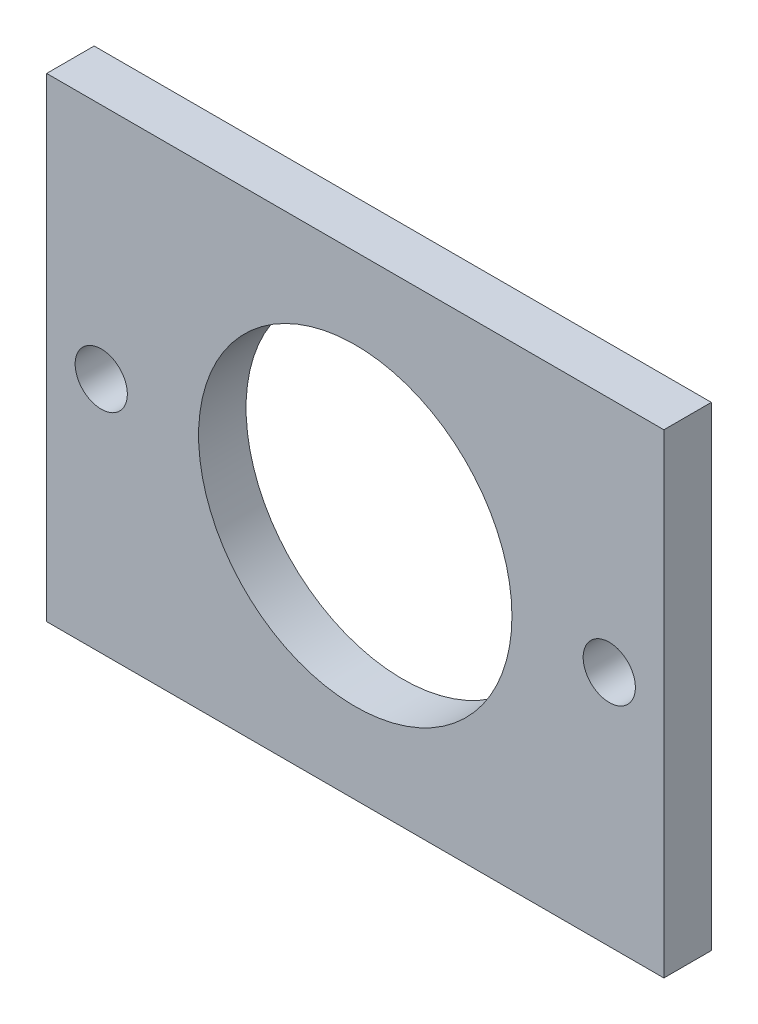
ISO-10303-21;
HEADER;
FILE_DESCRIPTION(('STEP AP214'),'2;1');
FILE_NAME('part.step','',(''),(''),'','','');
FILE_SCHEMA(('AUTOMOTIVE_DESIGN { 1 0 10303 214 1 1 1 1 }'));
ENDSEC;
DATA;
#1=APPLICATION_CONTEXT('core data for automotive mechanical design processes');
#2=APPLICATION_PROTOCOL_DEFINITION('international standard','automotive_design',2000,#1);
#3=PRODUCT_CONTEXT('',#1,'mechanical');
#4=PRODUCT('Part','Part','',(#3));
#5=PRODUCT_RELATED_PRODUCT_CATEGORY('part','',(#4));
#6=PRODUCT_DEFINITION_FORMATION('','',#4);
#7=PRODUCT_DEFINITION_CONTEXT('part definition',#1,'design');
#8=PRODUCT_DEFINITION('design','',#6,#7);
#9=PRODUCT_DEFINITION_SHAPE('','',#8);
#10=(LENGTH_UNIT() NAMED_UNIT(*) SI_UNIT(.MILLI.,.METRE.));
#11=(NAMED_UNIT(*) PLANE_ANGLE_UNIT() SI_UNIT($,.RADIAN.));
#12=(NAMED_UNIT(*) SI_UNIT($,.STERADIAN.) SOLID_ANGLE_UNIT());
#13=UNCERTAINTY_MEASURE_WITH_UNIT(LENGTH_MEASURE(1.E-05),#10,'distance_accuracy_value','');
#14=(GEOMETRIC_REPRESENTATION_CONTEXT(3) GLOBAL_UNCERTAINTY_ASSIGNED_CONTEXT((#13)) GLOBAL_UNIT_ASSIGNED_CONTEXT((#10,
#11,#12)) REPRESENTATION_CONTEXT('',''));
#15=CARTESIAN_POINT('',(0.,0.,0.));
#16=DIRECTION('',(0.,0.,1.));
#17=DIRECTION('',(1.,0.,0.));
#18=AXIS2_PLACEMENT_3D('',#15,#16,#17);
#19=CARTESIAN_POINT('',(0.,0.,9.2));
#20=DIRECTION('',(0.,0.,-1.));
#21=DIRECTION('',(-1.,0.,0.));
#22=AXIS2_PLACEMENT_3D('',#19,#20,#21);
#23=PLANE('',#22);
#24=DIRECTION('',(0.,-1.,0.));
#25=VECTOR('',#24,1.);
#26=CARTESIAN_POINT('',(-0.5,-10.,9.2));
#27=LINE('',#26,#25);
#28=CARTESIAN_POINT('',(-0.5,10.,9.2));
#29=VERTEX_POINT('',#28);
#30=CARTESIAN_POINT('',(-0.5,-10.,9.2));
#31=VERTEX_POINT('',#30);
#32=EDGE_CURVE('E91',#29,#31,#27,.T.);
#33=ORIENTED_EDGE('',*,*,#32,.T.);
#34=DIRECTION('',(1.,0.,0.));
#35=VECTOR('',#34,1.);
#36=CARTESIAN_POINT('',(-0.5,-10.,9.2));
#37=LINE('',#36,#35);
#38=CARTESIAN_POINT('',(25.5,-10.,9.2));
#39=VERTEX_POINT('',#38);
#40=EDGE_CURVE('E86',#31,#39,#37,.T.);
#41=ORIENTED_EDGE('',*,*,#40,.T.);
#42=DIRECTION('',(0.,1.,0.));
#43=VECTOR('',#42,1.);
#44=CARTESIAN_POINT('',(25.5,-10.,9.2));
#45=LINE('',#44,#43);
#46=CARTESIAN_POINT('',(25.5,10.,9.2));
#47=VERTEX_POINT('',#46);
#48=EDGE_CURVE('E87',#39,#47,#45,.T.);
#49=ORIENTED_EDGE('',*,*,#48,.T.);
#50=DIRECTION('',(-1.,0.,0.));
#51=VECTOR('',#50,1.);
#52=CARTESIAN_POINT('',(-0.5,10.,9.2));
#53=LINE('',#52,#51);
#54=EDGE_CURVE('E57',#47,#29,#53,.T.);
#55=ORIENTED_EDGE('',*,*,#54,.T.);
#56=EDGE_LOOP('',(#33,#41,#49,#55));
#57=FACE_BOUND('',#56,.T.);
#58=CARTESIAN_POINT('',(12.5,0.,9.2));
#59=DIRECTION('',(0.,0.,1.));
#60=DIRECTION('',(1.,0.,0.));
#61=AXIS2_PLACEMENT_3D('',#58,#59,#60);
#62=CIRCLE('',#61,6.6);
#63=CARTESIAN_POINT('',(19.1,0.,9.2));
#64=VERTEX_POINT('',#63);
#65=EDGE_CURVE('E107',#64,#64,#62,.T.);
#66=ORIENTED_EDGE('',*,*,#65,.F.);
#67=EDGE_LOOP('',(#66));
#68=FACE_BOUND('',#67,.T.);
#69=CARTESIAN_POINT('',(1.8,0.,9.2));
#70=DIRECTION('',(0.,0.,1.));
#71=DIRECTION('',(1.,0.,0.));
#72=AXIS2_PLACEMENT_3D('',#69,#70,#71);
#73=CIRCLE('',#72,1.1);
#74=CARTESIAN_POINT('',(2.9,0.,9.2));
#75=VERTEX_POINT('',#74);
#76=EDGE_CURVE('E123',#75,#75,#73,.T.);
#77=ORIENTED_EDGE('',*,*,#76,.F.);
#78=EDGE_LOOP('',(#77));
#79=FACE_BOUND('',#78,.T.);
#80=CARTESIAN_POINT('',(23.2,0.,9.2));
#81=DIRECTION('',(0.,0.,1.));
#82=DIRECTION('',(1.,0.,0.));
#83=AXIS2_PLACEMENT_3D('',#80,#81,#82);
#84=CIRCLE('',#83,1.1);
#85=CARTESIAN_POINT('',(24.3,0.,9.2));
#86=VERTEX_POINT('',#85);
#87=EDGE_CURVE('E130',#86,#86,#84,.T.);
#88=ORIENTED_EDGE('',*,*,#87,.F.);
#89=EDGE_LOOP('',(#88));
#90=FACE_BOUND('',#89,.T.);
#91=ADVANCED_FACE('F39',(#57,#68,#79,#90),#23,.F.);
#92=CARTESIAN_POINT('',(0.,0.,7.2));
#93=DIRECTION('',(0.,0.,-1.));
#94=DIRECTION('',(-1.,0.,0.));
#95=AXIS2_PLACEMENT_3D('',#92,#93,#94);
#96=PLANE('',#95);
#97=CARTESIAN_POINT('',(1.8,0.,7.2));
#98=DIRECTION('',(0.,0.,1.));
#99=DIRECTION('',(1.,0.,0.));
#100=AXIS2_PLACEMENT_3D('',#97,#98,#99);
#101=CIRCLE('',#100,1.1);
#102=CARTESIAN_POINT('',(2.9,0.,7.2));
#103=VERTEX_POINT('',#102);
#104=EDGE_CURVE('E125',#103,#103,#101,.T.);
#105=ORIENTED_EDGE('',*,*,#104,.T.);
#106=EDGE_LOOP('',(#105));
#107=FACE_BOUND('',#106,.T.);
#108=DIRECTION('',(0.,-1.,0.));
#109=VECTOR('',#108,1.);
#110=CARTESIAN_POINT('',(-0.5,-10.,7.2));
#111=LINE('',#110,#109);
#112=CARTESIAN_POINT('',(-0.5,10.,7.2));
#113=VERTEX_POINT('',#112);
#114=CARTESIAN_POINT('',(-0.5,-10.,7.2));
#115=VERTEX_POINT('',#114);
#116=EDGE_CURVE('E104',#113,#115,#111,.T.);
#117=ORIENTED_EDGE('',*,*,#116,.F.);
#118=DIRECTION('',(-1.,0.,0.));
#119=VECTOR('',#118,1.);
#120=CARTESIAN_POINT('',(-0.5,10.,7.2));
#121=LINE('',#120,#119);
#122=CARTESIAN_POINT('',(25.5,10.,7.2));
#123=VERTEX_POINT('',#122);
#124=EDGE_CURVE('E80',#123,#113,#121,.T.);
#125=ORIENTED_EDGE('',*,*,#124,.F.);
#126=DIRECTION('',(0.,1.,0.));
#127=VECTOR('',#126,1.);
#128=CARTESIAN_POINT('',(25.5,-10.,7.2));
#129=LINE('',#128,#127);
#130=CARTESIAN_POINT('',(25.5,-10.,7.2));
#131=VERTEX_POINT('',#130);
#132=EDGE_CURVE('E75',#131,#123,#129,.T.);
#133=ORIENTED_EDGE('',*,*,#132,.F.);
#134=DIRECTION('',(1.,0.,0.));
#135=VECTOR('',#134,1.);
#136=CARTESIAN_POINT('',(-0.5,-10.,7.2));
#137=LINE('',#136,#135);
#138=EDGE_CURVE('E94',#115,#131,#137,.T.);
#139=ORIENTED_EDGE('',*,*,#138,.F.);
#140=EDGE_LOOP('',(#117,#125,#133,#139));
#141=FACE_BOUND('',#140,.T.);
#142=CARTESIAN_POINT('',(12.5,0.,7.2));
#143=DIRECTION('',(0.,0.,1.));
#144=DIRECTION('',(1.,0.,0.));
#145=AXIS2_PLACEMENT_3D('',#142,#143,#144);
#146=CIRCLE('',#145,6.6);
#147=CARTESIAN_POINT('',(19.1,0.,7.2));
#148=VERTEX_POINT('',#147);
#149=EDGE_CURVE('E120',#148,#148,#146,.T.);
#150=ORIENTED_EDGE('',*,*,#149,.T.);
#151=EDGE_LOOP('',(#150));
#152=FACE_BOUND('',#151,.T.);
#153=CARTESIAN_POINT('',(23.2,0.,7.2));
#154=DIRECTION('',(0.,0.,1.));
#155=DIRECTION('',(1.,0.,0.));
#156=AXIS2_PLACEMENT_3D('',#153,#154,#155);
#157=CIRCLE('',#156,1.1);
#158=CARTESIAN_POINT('',(24.3,0.,7.2));
#159=VERTEX_POINT('',#158);
#160=EDGE_CURVE('E127',#159,#159,#157,.T.);
#161=ORIENTED_EDGE('',*,*,#160,.T.);
#162=EDGE_LOOP('',(#161));
#163=FACE_BOUND('',#162,.T.);
#164=ADVANCED_FACE('F114',(#107,#141,#152,#163),#96,.T.);
#165=CARTESIAN_POINT('',(-0.5,-10.,9.2));
#166=DIRECTION('',(1.,0.,0.));
#167=DIRECTION('',(0.,0.,-1.));
#168=AXIS2_PLACEMENT_3D('',#165,#166,#167);
#169=PLANE('',#168);
#170=ORIENTED_EDGE('',*,*,#116,.T.);
#171=DIRECTION('',(0.,0.,-1.));
#172=VECTOR('',#171,1.);
#173=CARTESIAN_POINT('',(-0.5,-10.,9.2));
#174=LINE('',#173,#172);
#175=EDGE_CURVE('E11',#31,#115,#174,.T.);
#176=ORIENTED_EDGE('',*,*,#175,.F.);
#177=ORIENTED_EDGE('',*,*,#32,.F.);
#178=DIRECTION('',(0.,0.,-1.));
#179=VECTOR('',#178,1.);
#180=CARTESIAN_POINT('',(-0.5,10.,9.2));
#181=LINE('',#180,#179);
#182=EDGE_CURVE('E98',#29,#113,#181,.T.);
#183=ORIENTED_EDGE('',*,*,#182,.T.);
#184=EDGE_LOOP('',(#170,#176,#177,#183));
#185=FACE_BOUND('',#184,.T.);
#186=ADVANCED_FACE('F41',(#185),#169,.F.);
#187=CARTESIAN_POINT('',(-0.5,-10.,9.2));
#188=DIRECTION('',(0.,1.,0.));
#189=DIRECTION('',(0.,0.,1.));
#190=AXIS2_PLACEMENT_3D('',#187,#188,#189);
#191=PLANE('',#190);
#192=ORIENTED_EDGE('',*,*,#138,.T.);
#193=DIRECTION('',(0.,0.,-1.));
#194=VECTOR('',#193,1.);
#195=CARTESIAN_POINT('',(25.5,-10.,9.2));
#196=LINE('',#195,#194);
#197=EDGE_CURVE('E48',#39,#131,#196,.T.);
#198=ORIENTED_EDGE('',*,*,#197,.F.);
#199=ORIENTED_EDGE('',*,*,#40,.F.);
#200=ORIENTED_EDGE('',*,*,#175,.T.);
#201=EDGE_LOOP('',(#192,#198,#199,#200));
#202=FACE_BOUND('',#201,.T.);
#203=ADVANCED_FACE('F92',(#202),#191,.F.);
#204=CARTESIAN_POINT('',(25.5,-10.,9.2));
#205=DIRECTION('',(-1.,0.,0.));
#206=DIRECTION('',(0.,0.,1.));
#207=AXIS2_PLACEMENT_3D('',#204,#205,#206);
#208=PLANE('',#207);
#209=ORIENTED_EDGE('',*,*,#132,.T.);
#210=DIRECTION('',(0.,0.,-1.));
#211=VECTOR('',#210,1.);
#212=CARTESIAN_POINT('',(25.5,10.,9.2));
#213=LINE('',#212,#211);
#214=EDGE_CURVE('E96',#47,#123,#213,.T.);
#215=ORIENTED_EDGE('',*,*,#214,.F.);
#216=ORIENTED_EDGE('',*,*,#48,.F.);
#217=ORIENTED_EDGE('',*,*,#197,.T.);
#218=EDGE_LOOP('',(#209,#215,#216,#217));
#219=FACE_BOUND('',#218,.T.);
#220=ADVANCED_FACE('F100',(#219),#208,.F.);
#221=CARTESIAN_POINT('',(-0.5,10.,9.2));
#222=DIRECTION('',(0.,-1.,0.));
#223=DIRECTION('',(0.,0.,-1.));
#224=AXIS2_PLACEMENT_3D('',#221,#222,#223);
#225=PLANE('',#224);
#226=ORIENTED_EDGE('',*,*,#124,.T.);
#227=ORIENTED_EDGE('',*,*,#182,.F.);
#228=ORIENTED_EDGE('',*,*,#54,.F.);
#229=ORIENTED_EDGE('',*,*,#214,.T.);
#230=EDGE_LOOP('',(#226,#227,#228,#229));
#231=FACE_BOUND('',#230,.T.);
#232=ADVANCED_FACE('F112',(#231),#225,.F.);
#233=CARTESIAN_POINT('',(12.5,0.,9.2));
#234=DIRECTION('',(0.,0.,-1.));
#235=DIRECTION('',(-1.,0.,0.));
#236=AXIS2_PLACEMENT_3D('',#233,#234,#235);
#237=CYLINDRICAL_SURFACE('',#236,6.6);
#238=ORIENTED_EDGE('',*,*,#65,.T.);
#239=EDGE_LOOP('',(#238));
#240=FACE_BOUND('',#239,.T.);
#241=ORIENTED_EDGE('',*,*,#149,.F.);
#242=EDGE_LOOP('',(#241));
#243=FACE_BOUND('',#242,.T.);
#244=ADVANCED_FACE('F150',(#240,#243),#237,.F.);
#245=CARTESIAN_POINT('',(1.8,0.,9.2));
#246=DIRECTION('',(0.,0.,-1.));
#247=DIRECTION('',(-1.,0.,0.));
#248=AXIS2_PLACEMENT_3D('',#245,#246,#247);
#249=CYLINDRICAL_SURFACE('',#248,1.1);
#250=ORIENTED_EDGE('',*,*,#76,.T.);
#251=EDGE_LOOP('',(#250));
#252=FACE_BOUND('',#251,.T.);
#253=ORIENTED_EDGE('',*,*,#104,.F.);
#254=EDGE_LOOP('',(#253));
#255=FACE_BOUND('',#254,.T.);
#256=ADVANCED_FACE('F195',(#252,#255),#249,.F.);
#257=CARTESIAN_POINT('',(23.2,0.,9.2));
#258=DIRECTION('',(0.,0.,-1.));
#259=DIRECTION('',(-1.,0.,0.));
#260=AXIS2_PLACEMENT_3D('',#257,#258,#259);
#261=CYLINDRICAL_SURFACE('',#260,1.1);
#262=ORIENTED_EDGE('',*,*,#87,.T.);
#263=EDGE_LOOP('',(#262));
#264=FACE_BOUND('',#263,.T.);
#265=ORIENTED_EDGE('',*,*,#160,.F.);
#266=EDGE_LOOP('',(#265));
#267=FACE_BOUND('',#266,.T.);
#268=ADVANCED_FACE('F136',(#264,#267),#261,.F.);
#269=CLOSED_SHELL('',(#91,#164,#186,#203,#220,#232,#244,#256,#268));
#270=MANIFOLD_SOLID_BREP('B2',#269);
#271=ADVANCED_BREP_SHAPE_REPRESENTATION('',(#18,#270),#14);
#272=SHAPE_DEFINITION_REPRESENTATION(#9,#271);
ENDSEC;
END-ISO-10303-21;
